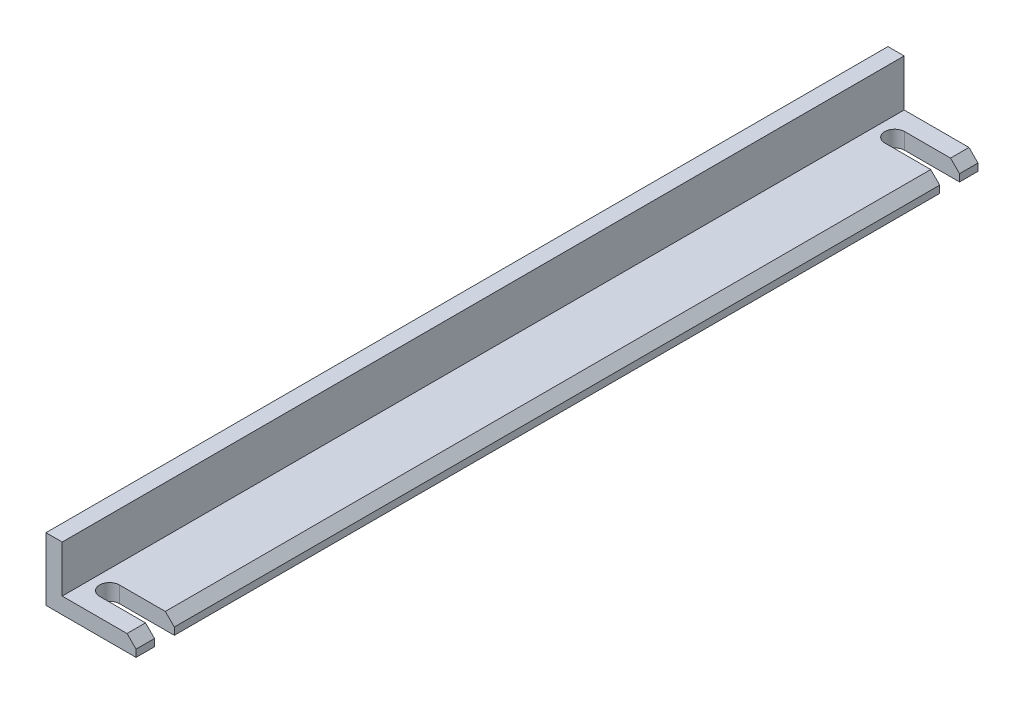
ISO-10303-21;
HEADER;
FILE_DESCRIPTION(('STEP AP214'),'2;1');
FILE_NAME('part.step','',(''),(''),'','','');
FILE_SCHEMA(('AUTOMOTIVE_DESIGN { 1 0 10303 214 1 1 1 1 }'));
ENDSEC;
DATA;
#1=APPLICATION_CONTEXT('core data for automotive mechanical design processes');
#2=APPLICATION_PROTOCOL_DEFINITION('international standard','automotive_design',2000,#1);
#3=PRODUCT_CONTEXT('',#1,'mechanical');
#4=PRODUCT('Part','Part','',(#3));
#5=PRODUCT_RELATED_PRODUCT_CATEGORY('part','',(#4));
#6=PRODUCT_DEFINITION_FORMATION('','',#4);
#7=PRODUCT_DEFINITION_CONTEXT('part definition',#1,'design');
#8=PRODUCT_DEFINITION('design','',#6,#7);
#9=PRODUCT_DEFINITION_SHAPE('','',#8);
#10=(LENGTH_UNIT() NAMED_UNIT(*) SI_UNIT(.MILLI.,.METRE.));
#11=(NAMED_UNIT(*) PLANE_ANGLE_UNIT() SI_UNIT($,.RADIAN.));
#12=(NAMED_UNIT(*) SI_UNIT($,.STERADIAN.) SOLID_ANGLE_UNIT());
#13=UNCERTAINTY_MEASURE_WITH_UNIT(LENGTH_MEASURE(1.E-05),#10,'distance_accuracy_value','');
#14=(GEOMETRIC_REPRESENTATION_CONTEXT(3) GLOBAL_UNCERTAINTY_ASSIGNED_CONTEXT((#13)) GLOBAL_UNIT_ASSIGNED_CONTEXT((#10,
#11,#12)) REPRESENTATION_CONTEXT('',''));
#15=CARTESIAN_POINT('',(0.,0.,0.));
#16=DIRECTION('',(0.,0.,1.));
#17=DIRECTION('',(1.,0.,0.));
#18=AXIS2_PLACEMENT_3D('',#15,#16,#17);
#19=CARTESIAN_POINT('',(0.,0.,46.75));
#20=DIRECTION('',(0.,1.,0.));
#21=DIRECTION('',(0.,0.,1.));
#22=AXIS2_PLACEMENT_3D('',#19,#20,#21);
#23=PLANE('',#22);
#24=DIRECTION('',(-1.,0.,0.));
#25=VECTOR('',#24,1.);
#26=CARTESIAN_POINT('',(0.,0.,-42.5));
#27=LINE('',#26,#25);
#28=CARTESIAN_POINT('',(10.,0.,-42.5));
#29=VERTEX_POINT('',#28);
#30=CARTESIAN_POINT('',(3.9,0.,-42.5));
#31=VERTEX_POINT('',#30);
#32=EDGE_CURVE('E190',#29,#31,#27,.T.);
#33=ORIENTED_EDGE('',*,*,#32,.F.);
#34=DIRECTION('',(0.,0.,-1.));
#35=VECTOR('',#34,1.);
#36=CARTESIAN_POINT('',(10.,0.,46.75));
#37=LINE('',#36,#35);
#38=CARTESIAN_POINT('',(10.,0.,42.5));
#39=VERTEX_POINT('',#38);
#40=EDGE_CURVE('E265',#39,#29,#37,.T.);
#41=ORIENTED_EDGE('',*,*,#40,.F.);
#42=DIRECTION('',(-1.,0.,0.));
#43=VECTOR('',#42,1.);
#44=CARTESIAN_POINT('',(0.,0.,42.5));
#45=LINE('',#44,#43);
#46=CARTESIAN_POINT('',(3.9,0.,42.5));
#47=VERTEX_POINT('',#46);
#48=EDGE_CURVE('E207',#39,#47,#45,.T.);
#49=ORIENTED_EDGE('',*,*,#48,.T.);
#50=CARTESIAN_POINT('',(3.9,0.,43.6));
#51=DIRECTION('',(0.,1.,0.));
#52=DIRECTION('',(0.,0.,1.));
#53=AXIS2_PLACEMENT_3D('',#50,#51,#52);
#54=CIRCLE('',#53,1.1);
#55=CARTESIAN_POINT('',(3.9,0.,44.7));
#56=VERTEX_POINT('',#55);
#57=EDGE_CURVE('E215',#47,#56,#54,.T.);
#58=ORIENTED_EDGE('',*,*,#57,.T.);
#59=DIRECTION('',(1.,0.,0.));
#60=VECTOR('',#59,1.);
#61=CARTESIAN_POINT('',(0.,0.,44.7));
#62=LINE('',#61,#60);
#63=CARTESIAN_POINT('',(10.,0.,44.7));
#64=VERTEX_POINT('',#63);
#65=EDGE_CURVE('E212',#56,#64,#62,.T.);
#66=ORIENTED_EDGE('',*,*,#65,.T.);
#67=CARTESIAN_POINT('',(10.,0.,46.75));
#68=VERTEX_POINT('',#67);
#69=EDGE_CURVE('E261',#68,#64,#37,.T.);
#70=ORIENTED_EDGE('',*,*,#69,.F.);
#71=DIRECTION('',(1.,0.,0.));
#72=VECTOR('',#71,1.);
#73=CARTESIAN_POINT('',(0.,0.,46.75));
#74=LINE('',#73,#72);
#75=CARTESIAN_POINT('',(0.,0.,46.75));
#76=VERTEX_POINT('',#75);
#77=EDGE_CURVE('E219',#76,#68,#74,.T.);
#78=ORIENTED_EDGE('',*,*,#77,.F.);
#79=DIRECTION('',(0.,0.,-1.));
#80=VECTOR('',#79,1.);
#81=CARTESIAN_POINT('',(0.,0.,46.75));
#82=LINE('',#81,#80);
#83=CARTESIAN_POINT('',(0.,0.,-46.75));
#84=VERTEX_POINT('',#83);
#85=EDGE_CURVE('E236',#76,#84,#82,.T.);
#86=ORIENTED_EDGE('',*,*,#85,.T.);
#87=DIRECTION('',(1.,0.,0.));
#88=VECTOR('',#87,1.);
#89=CARTESIAN_POINT('',(0.,0.,-46.75));
#90=LINE('',#89,#88);
#91=CARTESIAN_POINT('',(10.,0.,-46.75));
#92=VERTEX_POINT('',#91);
#93=EDGE_CURVE('E218',#84,#92,#90,.T.);
#94=ORIENTED_EDGE('',*,*,#93,.T.);
#95=CARTESIAN_POINT('',(10.,0.,-44.7));
#96=VERTEX_POINT('',#95);
#97=EDGE_CURVE('E260',#96,#92,#37,.T.);
#98=ORIENTED_EDGE('',*,*,#97,.F.);
#99=DIRECTION('',(1.,0.,0.));
#100=VECTOR('',#99,1.);
#101=CARTESIAN_POINT('',(0.,0.,-44.7));
#102=LINE('',#101,#100);
#103=CARTESIAN_POINT('',(3.9,0.,-44.7));
#104=VERTEX_POINT('',#103);
#105=EDGE_CURVE('E186',#104,#96,#102,.T.);
#106=ORIENTED_EDGE('',*,*,#105,.F.);
#107=CARTESIAN_POINT('',(3.9,0.,-43.6));
#108=DIRECTION('',(0.,1.,0.));
#109=DIRECTION('',(0.,0.,1.));
#110=AXIS2_PLACEMENT_3D('',#107,#108,#109);
#111=CIRCLE('',#110,1.1);
#112=EDGE_CURVE('E168',#31,#104,#111,.F.);
#113=ORIENTED_EDGE('',*,*,#112,.F.);
#114=EDGE_LOOP('',(#33,#41,#49,#58,#66,#70,#78,#86,#94,#98,#106,#113));
#115=FACE_BOUND('',#114,.T.);
#116=ADVANCED_FACE('F38',(#115),#23,.F.);
#117=CARTESIAN_POINT('',(10.,1.8,46.75));
#118=DIRECTION('',(1.,0.,0.));
#119=DIRECTION('',(0.,0.,-1.));
#120=AXIS2_PLACEMENT_3D('',#117,#118,#119);
#121=PLANE('',#120);
#122=ORIENTED_EDGE('',*,*,#40,.T.);
#123=DIRECTION('',(0.,1.,0.));
#124=VECTOR('',#123,1.);
#125=CARTESIAN_POINT('',(10.,1.8,-42.5));
#126=LINE('',#125,#124);
#127=CARTESIAN_POINT('',(10.,0.799999999999999,-42.5));
#128=VERTEX_POINT('',#127);
#129=EDGE_CURVE('E188',#29,#128,#126,.T.);
#130=ORIENTED_EDGE('',*,*,#129,.T.);
#131=DIRECTION('',(0.,0.,1.));
#132=VECTOR('',#131,1.);
#133=CARTESIAN_POINT('',(10.,0.799999999999999,46.75));
#134=LINE('',#133,#132);
#135=CARTESIAN_POINT('',(10.,0.799999999999999,42.5));
#136=VERTEX_POINT('',#135);
#137=EDGE_CURVE('E62',#128,#136,#134,.T.);
#138=ORIENTED_EDGE('',*,*,#137,.T.);
#139=DIRECTION('',(0.,1.,0.));
#140=VECTOR('',#139,1.);
#141=CARTESIAN_POINT('',(10.,1.8,42.5));
#142=LINE('',#141,#140);
#143=EDGE_CURVE('E204',#39,#136,#142,.T.);
#144=ORIENTED_EDGE('',*,*,#143,.F.);
#145=EDGE_LOOP('',(#122,#130,#138,#144));
#146=FACE_BOUND('',#145,.T.);
#147=ADVANCED_FACE('F319',(#146),#121,.T.);
#148=CARTESIAN_POINT('',(10.,0.799999999999999,-46.75));
#149=VERTEX_POINT('',#148);
#150=CARTESIAN_POINT('',(10.,0.799999999999999,-44.7));
#151=VERTEX_POINT('',#150);
#152=EDGE_CURVE('E273',#149,#151,#134,.T.);
#153=ORIENTED_EDGE('',*,*,#152,.T.);
#154=DIRECTION('',(0.,-1.,0.));
#155=VECTOR('',#154,1.);
#156=CARTESIAN_POINT('',(10.,1.8,-44.7));
#157=LINE('',#156,#155);
#158=EDGE_CURVE('E54',#151,#96,#157,.T.);
#159=ORIENTED_EDGE('',*,*,#158,.T.);
#160=ORIENTED_EDGE('',*,*,#97,.T.);
#161=DIRECTION('',(0.,-1.,0.));
#162=VECTOR('',#161,1.);
#163=CARTESIAN_POINT('',(10.,1.8,-46.75));
#164=LINE('',#163,#162);
#165=EDGE_CURVE('E239',#149,#92,#164,.T.);
#166=ORIENTED_EDGE('',*,*,#165,.F.);
#167=EDGE_LOOP('',(#153,#159,#160,#166));
#168=FACE_BOUND('',#167,.T.);
#169=ADVANCED_FACE('F287',(#168),#121,.T.);
#170=CARTESIAN_POINT('',(0.,1.8,46.75));
#171=DIRECTION('',(0.,1.,0.));
#172=DIRECTION('',(0.,0.,1.));
#173=AXIS2_PLACEMENT_3D('',#170,#171,#172);
#174=PLANE('',#173);
#175=DIRECTION('',(0.,0.,-1.));
#176=VECTOR('',#175,1.);
#177=CARTESIAN_POINT('',(9.,1.8,46.75));
#178=LINE('',#177,#176);
#179=CARTESIAN_POINT('',(9.,1.8,42.5));
#180=VERTEX_POINT('',#179);
#181=CARTESIAN_POINT('',(9.,1.8,-42.5));
#182=VERTEX_POINT('',#181);
#183=EDGE_CURVE('E270',#180,#182,#178,.T.);
#184=ORIENTED_EDGE('',*,*,#183,.T.);
#185=DIRECTION('',(-1.,0.,0.));
#186=VECTOR('',#185,1.);
#187=CARTESIAN_POINT('',(11.5225495708533,1.8,-42.5));
#188=LINE('',#187,#186);
#189=CARTESIAN_POINT('',(3.9,1.8,-42.5));
#190=VERTEX_POINT('',#189);
#191=EDGE_CURVE('E171',#182,#190,#188,.T.);
#192=ORIENTED_EDGE('',*,*,#191,.T.);
#193=CARTESIAN_POINT('',(3.9,1.8,-43.6));
#194=DIRECTION('',(0.,-1.,0.));
#195=DIRECTION('',(0.,0.,-1.));
#196=AXIS2_PLACEMENT_3D('',#193,#194,#195);
#197=CIRCLE('',#196,1.1);
#198=CARTESIAN_POINT('',(3.9,1.8,-44.7));
#199=VERTEX_POINT('',#198);
#200=EDGE_CURVE('E165',#190,#199,#197,.T.);
#201=ORIENTED_EDGE('',*,*,#200,.T.);
#202=DIRECTION('',(1.,0.,0.));
#203=VECTOR('',#202,1.);
#204=CARTESIAN_POINT('',(11.5225495708533,1.8,-44.7));
#205=LINE('',#204,#203);
#206=CARTESIAN_POINT('',(9.,1.8,-44.7));
#207=VERTEX_POINT('',#206);
#208=EDGE_CURVE('E174',#199,#207,#205,.T.);
#209=ORIENTED_EDGE('',*,*,#208,.T.);
#210=CARTESIAN_POINT('',(9.,1.8,-46.75));
#211=VERTEX_POINT('',#210);
#212=EDGE_CURVE('E264',#207,#211,#178,.T.);
#213=ORIENTED_EDGE('',*,*,#212,.T.);
#214=DIRECTION('',(1.,0.,0.));
#215=VECTOR('',#214,1.);
#216=CARTESIAN_POINT('',(0.,1.8,-46.75));
#217=LINE('',#216,#215);
#218=CARTESIAN_POINT('',(1.8,1.8,-46.75));
#219=VERTEX_POINT('',#218);
#220=EDGE_CURVE('E242',#219,#211,#217,.T.);
#221=ORIENTED_EDGE('',*,*,#220,.F.);
#222=DIRECTION('',(0.,0.,-1.));
#223=VECTOR('',#222,1.);
#224=CARTESIAN_POINT('',(1.8,1.8,46.75));
#225=LINE('',#224,#223);
#226=CARTESIAN_POINT('',(1.8,1.8,46.75));
#227=VERTEX_POINT('',#226);
#228=EDGE_CURVE('E258',#227,#219,#225,.T.);
#229=ORIENTED_EDGE('',*,*,#228,.F.);
#230=DIRECTION('',(1.,0.,0.));
#231=VECTOR('',#230,1.);
#232=CARTESIAN_POINT('',(0.,1.8,46.75));
#233=LINE('',#232,#231);
#234=CARTESIAN_POINT('',(9.,1.8,46.75));
#235=VERTEX_POINT('',#234);
#236=EDGE_CURVE('E225',#227,#235,#233,.T.);
#237=ORIENTED_EDGE('',*,*,#236,.T.);
#238=CARTESIAN_POINT('',(9.,1.8,44.7));
#239=VERTEX_POINT('',#238);
#240=EDGE_CURVE('E266',#235,#239,#178,.T.);
#241=ORIENTED_EDGE('',*,*,#240,.T.);
#242=DIRECTION('',(1.,0.,0.));
#243=VECTOR('',#242,1.);
#244=CARTESIAN_POINT('',(11.5225495708533,1.8,44.7));
#245=LINE('',#244,#243);
#246=CARTESIAN_POINT('',(3.9,1.8,44.7));
#247=VERTEX_POINT('',#246);
#248=EDGE_CURVE('E199',#247,#239,#245,.T.);
#249=ORIENTED_EDGE('',*,*,#248,.F.);
#250=CARTESIAN_POINT('',(3.9,1.8,43.6));
#251=DIRECTION('',(0.,1.,0.));
#252=DIRECTION('',(0.,0.,1.));
#253=AXIS2_PLACEMENT_3D('',#250,#251,#252);
#254=CIRCLE('',#253,1.1);
#255=CARTESIAN_POINT('',(3.9,1.8,42.5));
#256=VERTEX_POINT('',#255);
#257=EDGE_CURVE('E196',#256,#247,#254,.T.);
#258=ORIENTED_EDGE('',*,*,#257,.F.);
#259=DIRECTION('',(-1.,0.,0.));
#260=VECTOR('',#259,1.);
#261=CARTESIAN_POINT('',(11.5225495708533,1.8,42.5));
#262=LINE('',#261,#260);
#263=EDGE_CURVE('E193',#180,#256,#262,.T.);
#264=ORIENTED_EDGE('',*,*,#263,.F.);
#265=EDGE_LOOP('',(#184,#192,#201,#209,#213,#221,#229,#237,#241,#249,#258,#264));
#266=FACE_BOUND('',#265,.T.);
#267=ADVANCED_FACE('F180',(#266),#174,.T.);
#268=CARTESIAN_POINT('',(9.,1.8,46.75));
#269=DIRECTION('',(-0.707106781186547,-0.707106781186547,0.));
#270=DIRECTION('',(0.,0.,-1.));
#271=AXIS2_PLACEMENT_3D('',#268,#269,#270);
#272=PLANE('',#271);
#273=ORIENTED_EDGE('',*,*,#137,.F.);
#274=DIRECTION('',(0.707106781186548,-0.707106781186548,0.));
#275=VECTOR('',#274,1.);
#276=CARTESIAN_POINT('',(9.,1.8,-42.5));
#277=LINE('',#276,#275);
#278=EDGE_CURVE('E11',#128,#182,#277,.F.);
#279=ORIENTED_EDGE('',*,*,#278,.T.);
#280=ORIENTED_EDGE('',*,*,#183,.F.);
#281=DIRECTION('',(0.707106781186548,-0.707106781186548,0.));
#282=VECTOR('',#281,1.);
#283=CARTESIAN_POINT('',(9.,1.8,42.5));
#284=LINE('',#283,#282);
#285=EDGE_CURVE('E278',#136,#180,#284,.F.);
#286=ORIENTED_EDGE('',*,*,#285,.F.);
#287=EDGE_LOOP('',(#273,#279,#280,#286));
#288=FACE_BOUND('',#287,.T.);
#289=ADVANCED_FACE('F41',(#288),#272,.F.);
#290=ORIENTED_EDGE('',*,*,#212,.F.);
#291=DIRECTION('',(-0.707106781186548,0.707106781186548,0.));
#292=VECTOR('',#291,1.);
#293=CARTESIAN_POINT('',(9.,1.8,-44.7));
#294=LINE('',#293,#292);
#295=EDGE_CURVE('E47',#207,#151,#294,.F.);
#296=ORIENTED_EDGE('',*,*,#295,.T.);
#297=ORIENTED_EDGE('',*,*,#152,.F.);
#298=DIRECTION('',(-0.707106781186548,0.707106781186548,0.));
#299=VECTOR('',#298,1.);
#300=CARTESIAN_POINT('',(5.4,5.4,-46.75));
#301=LINE('',#300,#299);
#302=EDGE_CURVE('E269',#211,#149,#301,.F.);
#303=ORIENTED_EDGE('',*,*,#302,.F.);
#304=EDGE_LOOP('',(#290,#296,#297,#303));
#305=FACE_BOUND('',#304,.T.);
#306=ADVANCED_FACE('F283',(#305),#272,.F.);
#307=DIRECTION('',(0.,-1.,0.));
#308=VECTOR('',#307,1.);
#309=CARTESIAN_POINT('',(10.,1.8,44.7));
#310=LINE('',#309,#308);
#311=CARTESIAN_POINT('',(10.,0.799999999999999,44.7));
#312=VERTEX_POINT('',#311);
#313=EDGE_CURVE('E210',#312,#64,#310,.T.);
#314=ORIENTED_EDGE('',*,*,#313,.F.);
#315=CARTESIAN_POINT('',(10.,0.799999999999999,46.75));
#316=VERTEX_POINT('',#315);
#317=EDGE_CURVE('E272',#312,#316,#134,.T.);
#318=ORIENTED_EDGE('',*,*,#317,.T.);
#319=DIRECTION('',(0.,-1.,0.));
#320=VECTOR('',#319,1.);
#321=CARTESIAN_POINT('',(10.,1.8,46.75));
#322=LINE('',#321,#320);
#323=EDGE_CURVE('E222',#316,#68,#322,.T.);
#324=ORIENTED_EDGE('',*,*,#323,.T.);
#325=ORIENTED_EDGE('',*,*,#69,.T.);
#326=EDGE_LOOP('',(#314,#318,#324,#325));
#327=FACE_BOUND('',#326,.T.);
#328=ADVANCED_FACE('F333',(#327),#121,.T.);
#329=DIRECTION('',(-0.707106781186548,0.707106781186548,0.));
#330=VECTOR('',#329,1.);
#331=CARTESIAN_POINT('',(9.,1.8,44.7));
#332=LINE('',#331,#330);
#333=EDGE_CURVE('E280',#239,#312,#332,.F.);
#334=ORIENTED_EDGE('',*,*,#333,.F.);
#335=ORIENTED_EDGE('',*,*,#240,.F.);
#336=DIRECTION('',(0.707106781186548,-0.707106781186548,0.));
#337=VECTOR('',#336,1.);
#338=CARTESIAN_POINT('',(9.,1.8,46.75));
#339=LINE('',#338,#337);
#340=EDGE_CURVE('E276',#316,#235,#339,.F.);
#341=ORIENTED_EDGE('',*,*,#340,.F.);
#342=ORIENTED_EDGE('',*,*,#317,.F.);
#343=EDGE_LOOP('',(#334,#335,#341,#342));
#344=FACE_BOUND('',#343,.T.);
#345=ADVANCED_FACE('F341',(#344),#272,.F.);
#346=CARTESIAN_POINT('',(1.8,0.,46.75));
#347=DIRECTION('',(1.,0.,0.));
#348=DIRECTION('',(0.,0.,-1.));
#349=AXIS2_PLACEMENT_3D('',#346,#347,#348);
#350=PLANE('',#349);
#351=DIRECTION('',(0.,1.,0.));
#352=VECTOR('',#351,1.);
#353=CARTESIAN_POINT('',(1.8,0.,-46.75));
#354=LINE('',#353,#352);
#355=CARTESIAN_POINT('',(1.8,7.,-46.75));
#356=VERTEX_POINT('',#355);
#357=EDGE_CURVE('E245',#356,#219,#354,.F.);
#358=ORIENTED_EDGE('',*,*,#357,.F.);
#359=DIRECTION('',(0.,0.,-1.));
#360=VECTOR('',#359,1.);
#361=CARTESIAN_POINT('',(1.8,7.,46.75));
#362=LINE('',#361,#360);
#363=CARTESIAN_POINT('',(1.8,7.,46.75));
#364=VERTEX_POINT('',#363);
#365=EDGE_CURVE('E256',#364,#356,#362,.T.);
#366=ORIENTED_EDGE('',*,*,#365,.F.);
#367=DIRECTION('',(0.,1.,0.));
#368=VECTOR('',#367,1.);
#369=CARTESIAN_POINT('',(1.8,0.,46.75));
#370=LINE('',#369,#368);
#371=EDGE_CURVE('E228',#364,#227,#370,.F.);
#372=ORIENTED_EDGE('',*,*,#371,.T.);
#373=ORIENTED_EDGE('',*,*,#228,.T.);
#374=EDGE_LOOP('',(#358,#366,#372,#373));
#375=FACE_BOUND('',#374,.T.);
#376=ADVANCED_FACE('F308',(#375),#350,.T.);
#377=CARTESIAN_POINT('',(0.,7.,46.75));
#378=DIRECTION('',(0.,1.,0.));
#379=DIRECTION('',(0.,0.,1.));
#380=AXIS2_PLACEMENT_3D('',#377,#378,#379);
#381=PLANE('',#380);
#382=DIRECTION('',(1.,0.,0.));
#383=VECTOR('',#382,1.);
#384=CARTESIAN_POINT('',(0.,7.,-46.75));
#385=LINE('',#384,#383);
#386=CARTESIAN_POINT('',(0.,7.,-46.75));
#387=VERTEX_POINT('',#386);
#388=EDGE_CURVE('E248',#387,#356,#385,.T.);
#389=ORIENTED_EDGE('',*,*,#388,.F.);
#390=DIRECTION('',(0.,0.,-1.));
#391=VECTOR('',#390,1.);
#392=CARTESIAN_POINT('',(0.,7.,46.75));
#393=LINE('',#392,#391);
#394=CARTESIAN_POINT('',(0.,7.,46.75));
#395=VERTEX_POINT('',#394);
#396=EDGE_CURVE('E254',#395,#387,#393,.T.);
#397=ORIENTED_EDGE('',*,*,#396,.F.);
#398=DIRECTION('',(1.,0.,0.));
#399=VECTOR('',#398,1.);
#400=CARTESIAN_POINT('',(0.,7.,46.75));
#401=LINE('',#400,#399);
#402=EDGE_CURVE('E231',#395,#364,#401,.T.);
#403=ORIENTED_EDGE('',*,*,#402,.T.);
#404=ORIENTED_EDGE('',*,*,#365,.T.);
#405=EDGE_LOOP('',(#389,#397,#403,#404));
#406=FACE_BOUND('',#405,.T.);
#407=ADVANCED_FACE('F304',(#406),#381,.T.);
#408=CARTESIAN_POINT('',(0.,0.,46.75));
#409=DIRECTION('',(1.,0.,0.));
#410=DIRECTION('',(0.,0.,-1.));
#411=AXIS2_PLACEMENT_3D('',#408,#409,#410);
#412=PLANE('',#411);
#413=DIRECTION('',(0.,-1.,0.));
#414=VECTOR('',#413,1.);
#415=CARTESIAN_POINT('',(0.,0.,-46.75));
#416=LINE('',#415,#414);
#417=EDGE_CURVE('E223',#387,#84,#416,.T.);
#418=ORIENTED_EDGE('',*,*,#417,.T.);
#419=ORIENTED_EDGE('',*,*,#85,.F.);
#420=DIRECTION('',(0.,-1.,0.));
#421=VECTOR('',#420,1.);
#422=CARTESIAN_POINT('',(0.,0.,46.75));
#423=LINE('',#422,#421);
#424=EDGE_CURVE('E234',#395,#76,#423,.T.);
#425=ORIENTED_EDGE('',*,*,#424,.F.);
#426=ORIENTED_EDGE('',*,*,#396,.T.);
#427=EDGE_LOOP('',(#418,#419,#425,#426));
#428=FACE_BOUND('',#427,.T.);
#429=ADVANCED_FACE('F300',(#428),#412,.F.);
#430=CARTESIAN_POINT('',(0.,0.,46.75));
#431=DIRECTION('',(0.,0.,-1.));
#432=DIRECTION('',(-1.,0.,0.));
#433=AXIS2_PLACEMENT_3D('',#430,#431,#432);
#434=PLANE('',#433);
#435=ORIENTED_EDGE('',*,*,#323,.F.);
#436=ORIENTED_EDGE('',*,*,#340,.T.);
#437=ORIENTED_EDGE('',*,*,#236,.F.);
#438=ORIENTED_EDGE('',*,*,#371,.F.);
#439=ORIENTED_EDGE('',*,*,#402,.F.);
#440=ORIENTED_EDGE('',*,*,#424,.T.);
#441=ORIENTED_EDGE('',*,*,#77,.T.);
#442=EDGE_LOOP('',(#435,#436,#437,#438,#439,#440,#441));
#443=FACE_BOUND('',#442,.T.);
#444=ADVANCED_FACE('F338',(#443),#434,.F.);
#445=CARTESIAN_POINT('',(0.,0.,-46.75));
#446=DIRECTION('',(0.,0.,-1.));
#447=DIRECTION('',(-1.,0.,0.));
#448=AXIS2_PLACEMENT_3D('',#445,#446,#447);
#449=PLANE('',#448);
#450=ORIENTED_EDGE('',*,*,#220,.T.);
#451=ORIENTED_EDGE('',*,*,#302,.T.);
#452=ORIENTED_EDGE('',*,*,#165,.T.);
#453=ORIENTED_EDGE('',*,*,#93,.F.);
#454=ORIENTED_EDGE('',*,*,#417,.F.);
#455=ORIENTED_EDGE('',*,*,#388,.T.);
#456=ORIENTED_EDGE('',*,*,#357,.T.);
#457=EDGE_LOOP('',(#450,#451,#452,#453,#454,#455,#456));
#458=FACE_BOUND('',#457,.T.);
#459=ADVANCED_FACE('F291',(#458),#449,.T.);
#460=CARTESIAN_POINT('',(3.9,-8.2,43.6));
#461=DIRECTION('',(0.,1.,0.));
#462=DIRECTION('',(0.,0.,1.));
#463=AXIS2_PLACEMENT_3D('',#460,#461,#462);
#464=CYLINDRICAL_SURFACE('',#463,1.1);
#465=DIRECTION('',(0.,1.,0.));
#466=VECTOR('',#465,1.);
#467=CARTESIAN_POINT('',(3.9,-8.2,42.5));
#468=LINE('',#467,#466);
#469=EDGE_CURVE('E201',#47,#256,#468,.T.);
#470=ORIENTED_EDGE('',*,*,#469,.T.);
#471=ORIENTED_EDGE('',*,*,#257,.T.);
#472=DIRECTION('',(0.,1.,0.));
#473=VECTOR('',#472,1.);
#474=CARTESIAN_POINT('',(3.9,-8.2,44.7));
#475=LINE('',#474,#473);
#476=EDGE_CURVE('E202',#56,#247,#475,.T.);
#477=ORIENTED_EDGE('',*,*,#476,.F.);
#478=ORIENTED_EDGE('',*,*,#57,.F.);
#479=EDGE_LOOP('',(#470,#471,#477,#478));
#480=FACE_BOUND('',#479,.T.);
#481=ADVANCED_FACE('F325',(#480),#464,.F.);
#482=CARTESIAN_POINT('',(11.5225495708533,-8.2,44.7));
#483=DIRECTION('',(0.,0.,1.));
#484=DIRECTION('',(1.,0.,0.));
#485=AXIS2_PLACEMENT_3D('',#482,#483,#484);
#486=PLANE('',#485);
#487=ORIENTED_EDGE('',*,*,#476,.T.);
#488=ORIENTED_EDGE('',*,*,#248,.T.);
#489=ORIENTED_EDGE('',*,*,#333,.T.);
#490=ORIENTED_EDGE('',*,*,#313,.T.);
#491=ORIENTED_EDGE('',*,*,#65,.F.);
#492=EDGE_LOOP('',(#487,#488,#489,#490,#491));
#493=FACE_BOUND('',#492,.T.);
#494=ADVANCED_FACE('F329',(#493),#486,.F.);
#495=CARTESIAN_POINT('',(11.5225495708533,-8.2,42.5));
#496=DIRECTION('',(0.,0.,-1.));
#497=DIRECTION('',(-1.,0.,0.));
#498=AXIS2_PLACEMENT_3D('',#495,#496,#497);
#499=PLANE('',#498);
#500=ORIENTED_EDGE('',*,*,#143,.T.);
#501=ORIENTED_EDGE('',*,*,#285,.T.);
#502=ORIENTED_EDGE('',*,*,#263,.T.);
#503=ORIENTED_EDGE('',*,*,#469,.F.);
#504=ORIENTED_EDGE('',*,*,#48,.F.);
#505=EDGE_LOOP('',(#500,#501,#502,#503,#504));
#506=FACE_BOUND('',#505,.T.);
#507=ADVANCED_FACE('F323',(#506),#499,.F.);
#508=CARTESIAN_POINT('',(3.9,-8.2,-43.6));
#509=DIRECTION('',(0.,1.,0.));
#510=DIRECTION('',(0.,0.,1.));
#511=AXIS2_PLACEMENT_3D('',#508,#509,#510);
#512=CYLINDRICAL_SURFACE('',#511,1.1);
#513=ORIENTED_EDGE('',*,*,#112,.T.);
#514=DIRECTION('',(0.,1.,0.));
#515=VECTOR('',#514,1.);
#516=CARTESIAN_POINT('',(3.9,-8.2,-44.7));
#517=LINE('',#516,#515);
#518=EDGE_CURVE('E160',#104,#199,#517,.T.);
#519=ORIENTED_EDGE('',*,*,#518,.T.);
#520=ORIENTED_EDGE('',*,*,#200,.F.);
#521=DIRECTION('',(0.,1.,0.));
#522=VECTOR('',#521,1.);
#523=CARTESIAN_POINT('',(3.9,-8.2,-42.5));
#524=LINE('',#523,#522);
#525=EDGE_CURVE('E170',#31,#190,#524,.T.);
#526=ORIENTED_EDGE('',*,*,#525,.F.);
#527=EDGE_LOOP('',(#513,#519,#520,#526));
#528=FACE_BOUND('',#527,.T.);
#529=ADVANCED_FACE('F162',(#528),#512,.F.);
#530=CARTESIAN_POINT('',(11.5225495708533,-8.2,-42.5));
#531=DIRECTION('',(0.,0.,-1.));
#532=DIRECTION('',(-1.,0.,0.));
#533=AXIS2_PLACEMENT_3D('',#530,#531,#532);
#534=PLANE('',#533);
#535=ORIENTED_EDGE('',*,*,#32,.T.);
#536=ORIENTED_EDGE('',*,*,#525,.T.);
#537=ORIENTED_EDGE('',*,*,#191,.F.);
#538=ORIENTED_EDGE('',*,*,#278,.F.);
#539=ORIENTED_EDGE('',*,*,#129,.F.);
#540=EDGE_LOOP('',(#535,#536,#537,#538,#539));
#541=FACE_BOUND('',#540,.T.);
#542=ADVANCED_FACE('F317',(#541),#534,.T.);
#543=CARTESIAN_POINT('',(11.5225495708533,-8.2,-44.7));
#544=DIRECTION('',(0.,0.,1.));
#545=DIRECTION('',(1.,0.,0.));
#546=AXIS2_PLACEMENT_3D('',#543,#544,#545);
#547=PLANE('',#546);
#548=ORIENTED_EDGE('',*,*,#105,.T.);
#549=ORIENTED_EDGE('',*,*,#158,.F.);
#550=ORIENTED_EDGE('',*,*,#295,.F.);
#551=ORIENTED_EDGE('',*,*,#208,.F.);
#552=ORIENTED_EDGE('',*,*,#518,.F.);
#553=EDGE_LOOP('',(#548,#549,#550,#551,#552));
#554=FACE_BOUND('',#553,.T.);
#555=ADVANCED_FACE('F175',(#554),#547,.T.);
#556=CLOSED_SHELL('',(#116,#147,#169,#267,#289,#306,#328,#345,#376,#407,#429,#444,#459,#481,
#494,#507,#529,#542,#555));
#557=MANIFOLD_SOLID_BREP('B2',#556);
#558=ADVANCED_BREP_SHAPE_REPRESENTATION('',(#18,#557),#14);
#559=SHAPE_DEFINITION_REPRESENTATION(#9,#558);
ENDSEC;
END-ISO-10303-21;
